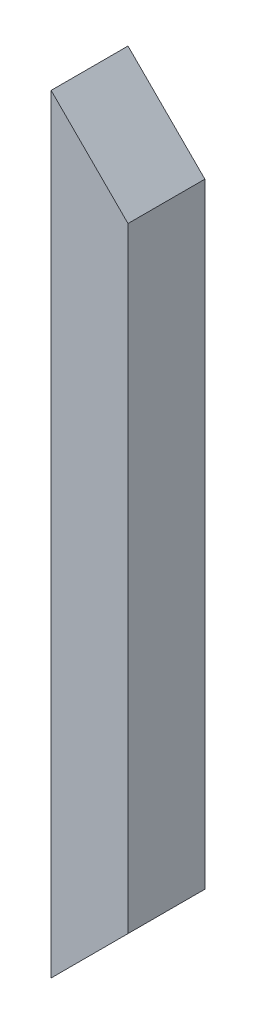
ISO-10303-21;
HEADER;
FILE_DESCRIPTION(('STEP AP214'),'2;1');
FILE_NAME('part.step','',(''),(''),'','','');
FILE_SCHEMA(('AUTOMOTIVE_DESIGN { 1 0 10303 214 1 1 1 1 }'));
ENDSEC;
DATA;
#1=APPLICATION_CONTEXT('core data for automotive mechanical design processes');
#2=APPLICATION_PROTOCOL_DEFINITION('international standard','automotive_design',2000,#1);
#3=PRODUCT_CONTEXT('',#1,'mechanical');
#4=PRODUCT('Part','Part','',(#3));
#5=PRODUCT_RELATED_PRODUCT_CATEGORY('part','',(#4));
#6=PRODUCT_DEFINITION_FORMATION('','',#4);
#7=PRODUCT_DEFINITION_CONTEXT('part definition',#1,'design');
#8=PRODUCT_DEFINITION('design','',#6,#7);
#9=PRODUCT_DEFINITION_SHAPE('','',#8);
#10=(LENGTH_UNIT() NAMED_UNIT(*) SI_UNIT(.MILLI.,.METRE.));
#11=(NAMED_UNIT(*) PLANE_ANGLE_UNIT() SI_UNIT($,.RADIAN.));
#12=(NAMED_UNIT(*) SI_UNIT($,.STERADIAN.) SOLID_ANGLE_UNIT());
#13=UNCERTAINTY_MEASURE_WITH_UNIT(LENGTH_MEASURE(1.E-05),#10,'distance_accuracy_value','');
#14=(GEOMETRIC_REPRESENTATION_CONTEXT(3) GLOBAL_UNCERTAINTY_ASSIGNED_CONTEXT((#13)) GLOBAL_UNIT_ASSIGNED_CONTEXT((#10,
#11,#12)) REPRESENTATION_CONTEXT('',''));
#15=CARTESIAN_POINT('',(0.,0.,0.));
#16=DIRECTION('',(0.,0.,1.));
#17=DIRECTION('',(1.,0.,0.));
#18=AXIS2_PLACEMENT_3D('',#15,#16,#17);
#19=CARTESIAN_POINT('',(25.,500.,-25.));
#20=DIRECTION('',(0.,0.,1.));
#21=DIRECTION('',(1.,0.,0.));
#22=AXIS2_PLACEMENT_3D('',#19,#20,#21);
#23=PLANE('',#22);
#24=DIRECTION('',(0.,-1.,0.));
#25=VECTOR('',#24,1.);
#26=CARTESIAN_POINT('',(-25.,500.,-25.));
#27=LINE('',#26,#25);
#28=CARTESIAN_POINT('',(-25.,500.,-25.));
#29=VERTEX_POINT('',#28);
#30=CARTESIAN_POINT('',(-25.,0.,-25.));
#31=VERTEX_POINT('',#30);
#32=EDGE_CURVE('E11',#29,#31,#27,.T.);
#33=ORIENTED_EDGE('',*,*,#32,.F.);
#34=DIRECTION('',(0.707106781186557,-0.707106781186538,0.));
#35=VECTOR('',#34,1.);
#36=CARTESIAN_POINT('',(-25.,500.,-25.));
#37=LINE('',#36,#35);
#38=CARTESIAN_POINT('',(25.,450.000000000001,-25.));
#39=VERTEX_POINT('',#38);
#40=EDGE_CURVE('E58',#29,#39,#37,.T.);
#41=ORIENTED_EDGE('',*,*,#40,.T.);
#42=DIRECTION('',(0.,-1.,0.));
#43=VECTOR('',#42,1.);
#44=CARTESIAN_POINT('',(25.,500.,-25.));
#45=LINE('',#44,#43);
#46=CARTESIAN_POINT('',(25.,50.0000000000013,-25.));
#47=VERTEX_POINT('',#46);
#48=EDGE_CURVE('E93',#39,#47,#45,.T.);
#49=ORIENTED_EDGE('',*,*,#48,.T.);
#50=DIRECTION('',(-0.707106781186539,-0.707106781186556,0.));
#51=VECTOR('',#50,1.);
#52=CARTESIAN_POINT('',(-25.,0.,-25.));
#53=LINE('',#52,#51);
#54=EDGE_CURVE('E124',#47,#31,#53,.T.);
#55=ORIENTED_EDGE('',*,*,#54,.T.);
#56=EDGE_LOOP('',(#33,#41,#49,#55));
#57=FACE_BOUND('',#56,.T.);
#58=ADVANCED_FACE('F43',(#57),#23,.F.);
#59=CARTESIAN_POINT('',(-25.,500.,-25.));
#60=DIRECTION('',(1.,0.,0.));
#61=DIRECTION('',(0.,0.,-1.));
#62=AXIS2_PLACEMENT_3D('',#59,#60,#61);
#63=PLANE('',#62);
#64=DIRECTION('',(0.,0.,1.));
#65=VECTOR('',#64,1.);
#66=CARTESIAN_POINT('',(-25.,0.,-25.));
#67=LINE('',#66,#65);
#68=CARTESIAN_POINT('',(-25.,0.,25.));
#69=VERTEX_POINT('',#68);
#70=EDGE_CURVE('E87',#31,#69,#67,.T.);
#71=ORIENTED_EDGE('',*,*,#70,.T.);
#72=DIRECTION('',(0.,-1.,0.));
#73=VECTOR('',#72,1.);
#74=CARTESIAN_POINT('',(-25.,500.,25.));
#75=LINE('',#74,#73);
#76=CARTESIAN_POINT('',(-25.,500.,25.));
#77=VERTEX_POINT('',#76);
#78=EDGE_CURVE('E52',#77,#69,#75,.T.);
#79=ORIENTED_EDGE('',*,*,#78,.F.);
#80=DIRECTION('',(0.,0.,1.));
#81=VECTOR('',#80,1.);
#82=CARTESIAN_POINT('',(-25.,500.,-25.));
#83=LINE('',#82,#81);
#84=EDGE_CURVE('E101',#29,#77,#83,.T.);
#85=ORIENTED_EDGE('',*,*,#84,.F.);
#86=ORIENTED_EDGE('',*,*,#32,.T.);
#87=EDGE_LOOP('',(#71,#79,#85,#86));
#88=FACE_BOUND('',#87,.T.);
#89=ADVANCED_FACE('F117',(#88),#63,.F.);
#90=CARTESIAN_POINT('',(25.,500.,25.));
#91=DIRECTION('',(0.,0.,1.));
#92=DIRECTION('',(1.,0.,0.));
#93=AXIS2_PLACEMENT_3D('',#90,#91,#92);
#94=PLANE('',#93);
#95=DIRECTION('',(0.707106781186557,-0.707106781186538,0.));
#96=VECTOR('',#95,1.);
#97=CARTESIAN_POINT('',(-25.,500.,25.));
#98=LINE('',#97,#96);
#99=CARTESIAN_POINT('',(25.,450.000000000001,25.));
#100=VERTEX_POINT('',#99);
#101=EDGE_CURVE('E81',#77,#100,#98,.T.);
#102=ORIENTED_EDGE('',*,*,#101,.F.);
#103=ORIENTED_EDGE('',*,*,#78,.T.);
#104=DIRECTION('',(-0.707106781186539,-0.707106781186556,0.));
#105=VECTOR('',#104,1.);
#106=CARTESIAN_POINT('',(-25.,0.,25.));
#107=LINE('',#106,#105);
#108=CARTESIAN_POINT('',(25.,50.0000000000013,25.));
#109=VERTEX_POINT('',#108);
#110=EDGE_CURVE('E115',#109,#69,#107,.T.);
#111=ORIENTED_EDGE('',*,*,#110,.F.);
#112=DIRECTION('',(0.,-1.,0.));
#113=VECTOR('',#112,1.);
#114=CARTESIAN_POINT('',(25.,500.,25.));
#115=LINE('',#114,#113);
#116=EDGE_CURVE('E100',#100,#109,#115,.T.);
#117=ORIENTED_EDGE('',*,*,#116,.F.);
#118=EDGE_LOOP('',(#102,#103,#111,#117));
#119=FACE_BOUND('',#118,.T.);
#120=ADVANCED_FACE('F114',(#119),#94,.T.);
#121=CARTESIAN_POINT('',(25.,500.,-25.));
#122=DIRECTION('',(1.,0.,0.));
#123=DIRECTION('',(0.,0.,-1.));
#124=AXIS2_PLACEMENT_3D('',#121,#122,#123);
#125=PLANE('',#124);
#126=DIRECTION('',(0.,0.,1.));
#127=VECTOR('',#126,1.);
#128=CARTESIAN_POINT('',(25.,450.000000000001,-25.));
#129=LINE('',#128,#127);
#130=EDGE_CURVE('E78',#39,#100,#129,.T.);
#131=ORIENTED_EDGE('',*,*,#130,.T.);
#132=ORIENTED_EDGE('',*,*,#116,.T.);
#133=DIRECTION('',(0.,0.,1.));
#134=VECTOR('',#133,1.);
#135=CARTESIAN_POINT('',(25.,50.0000000000013,-25.));
#136=LINE('',#135,#134);
#137=EDGE_CURVE('E98',#47,#109,#136,.T.);
#138=ORIENTED_EDGE('',*,*,#137,.F.);
#139=ORIENTED_EDGE('',*,*,#48,.F.);
#140=EDGE_LOOP('',(#131,#132,#138,#139));
#141=FACE_BOUND('',#140,.T.);
#142=ADVANCED_FACE('F97',(#141),#125,.T.);
#143=CARTESIAN_POINT('',(-25.,0.,-25.));
#144=DIRECTION('',(-0.707106781186556,0.707106781186539,0.));
#145=DIRECTION('',(-0.707106781186539,-0.707106781186556,0.));
#146=AXIS2_PLACEMENT_3D('',#143,#144,#145);
#147=PLANE('',#146);
#148=ORIENTED_EDGE('',*,*,#110,.T.);
#149=ORIENTED_EDGE('',*,*,#70,.F.);
#150=ORIENTED_EDGE('',*,*,#54,.F.);
#151=ORIENTED_EDGE('',*,*,#137,.T.);
#152=EDGE_LOOP('',(#148,#149,#150,#151));
#153=FACE_BOUND('',#152,.T.);
#154=ADVANCED_FACE('F129',(#153),#147,.F.);
#155=CARTESIAN_POINT('',(-25.,500.,-25.));
#156=DIRECTION('',(-0.707106781186538,-0.707106781186557,0.));
#157=DIRECTION('',(0.707106781186557,-0.707106781186538,0.));
#158=AXIS2_PLACEMENT_3D('',#155,#156,#157);
#159=PLANE('',#158);
#160=ORIENTED_EDGE('',*,*,#101,.T.);
#161=ORIENTED_EDGE('',*,*,#130,.F.);
#162=ORIENTED_EDGE('',*,*,#40,.F.);
#163=ORIENTED_EDGE('',*,*,#84,.T.);
#164=EDGE_LOOP('',(#160,#161,#162,#163));
#165=FACE_BOUND('',#164,.T.);
#166=ADVANCED_FACE('F79',(#165),#159,.F.);
#167=CLOSED_SHELL('',(#58,#89,#120,#142,#154,#166));
#168=MANIFOLD_SOLID_BREP('B2',#167);
#169=ADVANCED_BREP_SHAPE_REPRESENTATION('',(#18,#168),#14);
#170=SHAPE_DEFINITION_REPRESENTATION(#9,#169);
ENDSEC;
END-ISO-10303-21;
